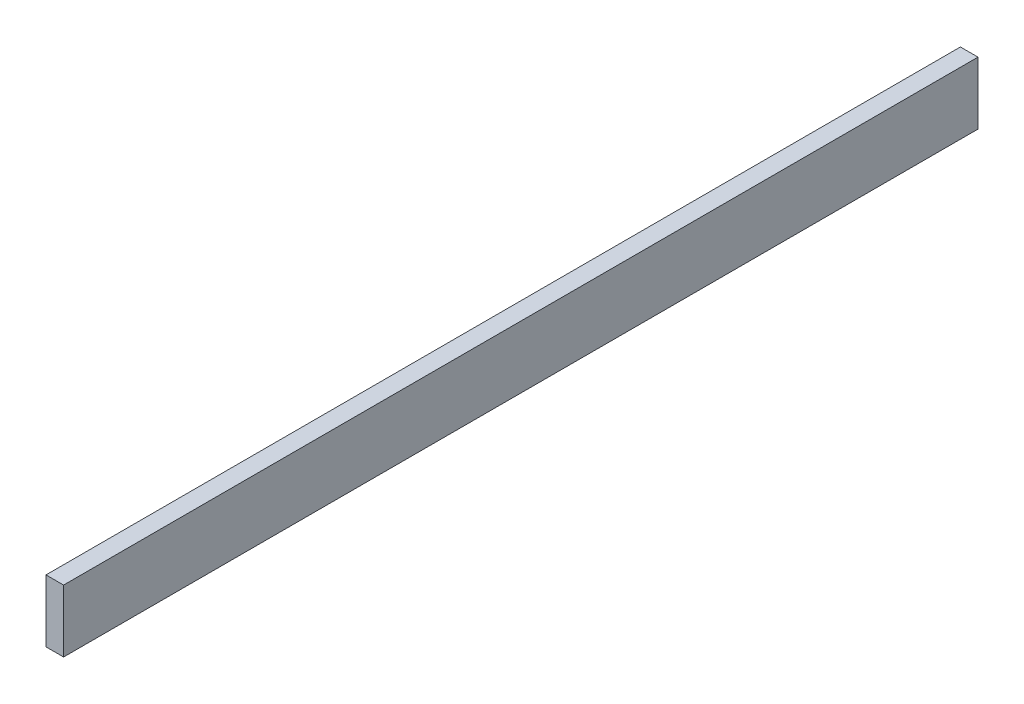
ISO-10303-21;
HEADER;
FILE_DESCRIPTION(('STEP AP214'),'2;1');
FILE_NAME('part.step','',(''),(''),'','','');
FILE_SCHEMA(('AUTOMOTIVE_DESIGN { 1 0 10303 214 1 1 1 1 }'));
ENDSEC;
DATA;
#1=APPLICATION_CONTEXT('core data for automotive mechanical design processes');
#2=APPLICATION_PROTOCOL_DEFINITION('international standard','automotive_design',2000,#1);
#3=PRODUCT_CONTEXT('',#1,'mechanical');
#4=PRODUCT('Part','Part','',(#3));
#5=PRODUCT_RELATED_PRODUCT_CATEGORY('part','',(#4));
#6=PRODUCT_DEFINITION_FORMATION('','',#4);
#7=PRODUCT_DEFINITION_CONTEXT('part definition',#1,'design');
#8=PRODUCT_DEFINITION('design','',#6,#7);
#9=PRODUCT_DEFINITION_SHAPE('','',#8);
#10=(LENGTH_UNIT() NAMED_UNIT(*) SI_UNIT(.MILLI.,.METRE.));
#11=(NAMED_UNIT(*) PLANE_ANGLE_UNIT() SI_UNIT($,.RADIAN.));
#12=(NAMED_UNIT(*) SI_UNIT($,.STERADIAN.) SOLID_ANGLE_UNIT());
#13=UNCERTAINTY_MEASURE_WITH_UNIT(LENGTH_MEASURE(1.E-05),#10,'distance_accuracy_value','');
#14=(GEOMETRIC_REPRESENTATION_CONTEXT(3) GLOBAL_UNCERTAINTY_ASSIGNED_CONTEXT((#13)) GLOBAL_UNIT_ASSIGNED_CONTEXT((#10,
#11,#12)) REPRESENTATION_CONTEXT('',''));
#15=CARTESIAN_POINT('',(0.,0.,0.));
#16=DIRECTION('',(0.,0.,1.));
#17=DIRECTION('',(1.,0.,0.));
#18=AXIS2_PLACEMENT_3D('',#15,#16,#17);
#19=CARTESIAN_POINT('',(0.,14.,-660.));
#20=DIRECTION('',(-1.,0.,0.));
#21=DIRECTION('',(0.,0.,1.));
#22=AXIS2_PLACEMENT_3D('',#19,#20,#21);
#23=PLANE('',#22);
#24=DIRECTION('',(0.,-1.,0.));
#25=VECTOR('',#24,1.);
#26=CARTESIAN_POINT('',(0.,14.,0.));
#27=LINE('',#26,#25);
#28=CARTESIAN_POINT('',(0.,59.,0.));
#29=VERTEX_POINT('',#28);
#30=CARTESIAN_POINT('',(0.,14.,0.));
#31=VERTEX_POINT('',#30);
#32=EDGE_CURVE('E103',#29,#31,#27,.T.);
#33=ORIENTED_EDGE('',*,*,#32,.F.);
#34=DIRECTION('',(0.,0.,1.));
#35=VECTOR('',#34,1.);
#36=CARTESIAN_POINT('',(0.,59.,-660.));
#37=LINE('',#36,#35);
#38=CARTESIAN_POINT('',(0.,59.,-660.));
#39=VERTEX_POINT('',#38);
#40=EDGE_CURVE('E11',#39,#29,#37,.T.);
#41=ORIENTED_EDGE('',*,*,#40,.F.);
#42=DIRECTION('',(0.,-1.,0.));
#43=VECTOR('',#42,1.);
#44=CARTESIAN_POINT('',(0.,14.,-660.));
#45=LINE('',#44,#43);
#46=CARTESIAN_POINT('',(0.,14.,-660.));
#47=VERTEX_POINT('',#46);
#48=EDGE_CURVE('E97',#39,#47,#45,.T.);
#49=ORIENTED_EDGE('',*,*,#48,.T.);
#50=DIRECTION('',(0.,0.,1.));
#51=VECTOR('',#50,1.);
#52=CARTESIAN_POINT('',(0.,14.,-660.));
#53=LINE('',#52,#51);
#54=EDGE_CURVE('E42',#47,#31,#53,.T.);
#55=ORIENTED_EDGE('',*,*,#54,.T.);
#56=EDGE_LOOP('',(#33,#41,#49,#55));
#57=FACE_BOUND('',#56,.T.);
#58=ADVANCED_FACE('F39',(#57),#23,.T.);
#59=CARTESIAN_POINT('',(0.,59.,-660.));
#60=DIRECTION('',(0.,1.,0.));
#61=DIRECTION('',(0.,0.,1.));
#62=AXIS2_PLACEMENT_3D('',#59,#60,#61);
#63=PLANE('',#62);
#64=DIRECTION('',(-1.,0.,0.));
#65=VECTOR('',#64,1.);
#66=CARTESIAN_POINT('',(0.,59.,0.));
#67=LINE('',#66,#65);
#68=CARTESIAN_POINT('',(12.7,59.,0.));
#69=VERTEX_POINT('',#68);
#70=EDGE_CURVE('E99',#69,#29,#67,.T.);
#71=ORIENTED_EDGE('',*,*,#70,.F.);
#72=DIRECTION('',(0.,0.,1.));
#73=VECTOR('',#72,1.);
#74=CARTESIAN_POINT('',(12.7,59.,-660.));
#75=LINE('',#74,#73);
#76=CARTESIAN_POINT('',(12.7,59.,-660.));
#77=VERTEX_POINT('',#76);
#78=EDGE_CURVE('E48',#77,#69,#75,.T.);
#79=ORIENTED_EDGE('',*,*,#78,.F.);
#80=DIRECTION('',(-1.,0.,0.));
#81=VECTOR('',#80,1.);
#82=CARTESIAN_POINT('',(0.,59.,-660.));
#83=LINE('',#82,#81);
#84=EDGE_CURVE('E94',#77,#39,#83,.T.);
#85=ORIENTED_EDGE('',*,*,#84,.T.);
#86=ORIENTED_EDGE('',*,*,#40,.T.);
#87=EDGE_LOOP('',(#71,#79,#85,#86));
#88=FACE_BOUND('',#87,.T.);
#89=ADVANCED_FACE('F113',(#88),#63,.T.);
#90=CARTESIAN_POINT('',(12.7,14.,-660.));
#91=DIRECTION('',(1.,0.,0.));
#92=DIRECTION('',(0.,0.,-1.));
#93=AXIS2_PLACEMENT_3D('',#90,#91,#92);
#94=PLANE('',#93);
#95=DIRECTION('',(0.,1.,0.));
#96=VECTOR('',#95,1.);
#97=CARTESIAN_POINT('',(12.7,14.,0.));
#98=LINE('',#97,#96);
#99=CARTESIAN_POINT('',(12.7,14.,0.));
#100=VERTEX_POINT('',#99);
#101=EDGE_CURVE('E89',#100,#69,#98,.T.);
#102=ORIENTED_EDGE('',*,*,#101,.F.);
#103=DIRECTION('',(0.,0.,1.));
#104=VECTOR('',#103,1.);
#105=CARTESIAN_POINT('',(12.7,14.,-660.));
#106=LINE('',#105,#104);
#107=CARTESIAN_POINT('',(12.7,14.,-660.));
#108=VERTEX_POINT('',#107);
#109=EDGE_CURVE('E84',#108,#100,#106,.T.);
#110=ORIENTED_EDGE('',*,*,#109,.F.);
#111=DIRECTION('',(0.,1.,0.));
#112=VECTOR('',#111,1.);
#113=CARTESIAN_POINT('',(12.7,14.,-660.));
#114=LINE('',#113,#112);
#115=EDGE_CURVE('E87',#108,#77,#114,.T.);
#116=ORIENTED_EDGE('',*,*,#115,.T.);
#117=ORIENTED_EDGE('',*,*,#78,.T.);
#118=EDGE_LOOP('',(#102,#110,#116,#117));
#119=FACE_BOUND('',#118,.T.);
#120=ADVANCED_FACE('F86',(#119),#94,.T.);
#121=CARTESIAN_POINT('',(0.,14.,-660.));
#122=DIRECTION('',(0.,-1.,0.));
#123=DIRECTION('',(0.,0.,-1.));
#124=AXIS2_PLACEMENT_3D('',#121,#122,#123);
#125=PLANE('',#124);
#126=DIRECTION('',(1.,0.,0.));
#127=VECTOR('',#126,1.);
#128=CARTESIAN_POINT('',(0.,14.,0.));
#129=LINE('',#128,#127);
#130=EDGE_CURVE('E106',#31,#100,#129,.T.);
#131=ORIENTED_EDGE('',*,*,#130,.F.);
#132=ORIENTED_EDGE('',*,*,#54,.F.);
#133=DIRECTION('',(1.,0.,0.));
#134=VECTOR('',#133,1.);
#135=CARTESIAN_POINT('',(0.,14.,-660.));
#136=LINE('',#135,#134);
#137=EDGE_CURVE('E93',#47,#108,#136,.T.);
#138=ORIENTED_EDGE('',*,*,#137,.T.);
#139=ORIENTED_EDGE('',*,*,#109,.T.);
#140=EDGE_LOOP('',(#131,#132,#138,#139));
#141=FACE_BOUND('',#140,.T.);
#142=ADVANCED_FACE('F96',(#141),#125,.T.);
#143=CARTESIAN_POINT('',(0.,0.,-660.));
#144=DIRECTION('',(0.,0.,-1.));
#145=DIRECTION('',(-1.,0.,0.));
#146=AXIS2_PLACEMENT_3D('',#143,#144,#145);
#147=PLANE('',#146);
#148=ORIENTED_EDGE('',*,*,#48,.F.);
#149=ORIENTED_EDGE('',*,*,#84,.F.);
#150=ORIENTED_EDGE('',*,*,#115,.F.);
#151=ORIENTED_EDGE('',*,*,#137,.F.);
#152=EDGE_LOOP('',(#148,#149,#150,#151));
#153=FACE_BOUND('',#152,.T.);
#154=ADVANCED_FACE('F92',(#153),#147,.T.);
#155=CARTESIAN_POINT('',(0.,0.,0.));
#156=DIRECTION('',(0.,0.,-1.));
#157=DIRECTION('',(-1.,0.,0.));
#158=AXIS2_PLACEMENT_3D('',#155,#156,#157);
#159=PLANE('',#158);
#160=ORIENTED_EDGE('',*,*,#32,.T.);
#161=ORIENTED_EDGE('',*,*,#130,.T.);
#162=ORIENTED_EDGE('',*,*,#101,.T.);
#163=ORIENTED_EDGE('',*,*,#70,.T.);
#164=EDGE_LOOP('',(#160,#161,#162,#163));
#165=FACE_BOUND('',#164,.T.);
#166=ADVANCED_FACE('F112',(#165),#159,.F.);
#167=CLOSED_SHELL('',(#58,#89,#120,#142,#154,#166));
#168=MANIFOLD_SOLID_BREP('B2',#167);
#169=ADVANCED_BREP_SHAPE_REPRESENTATION('',(#18,#168),#14);
#170=SHAPE_DEFINITION_REPRESENTATION(#9,#169);
ENDSEC;
END-ISO-10303-21;
